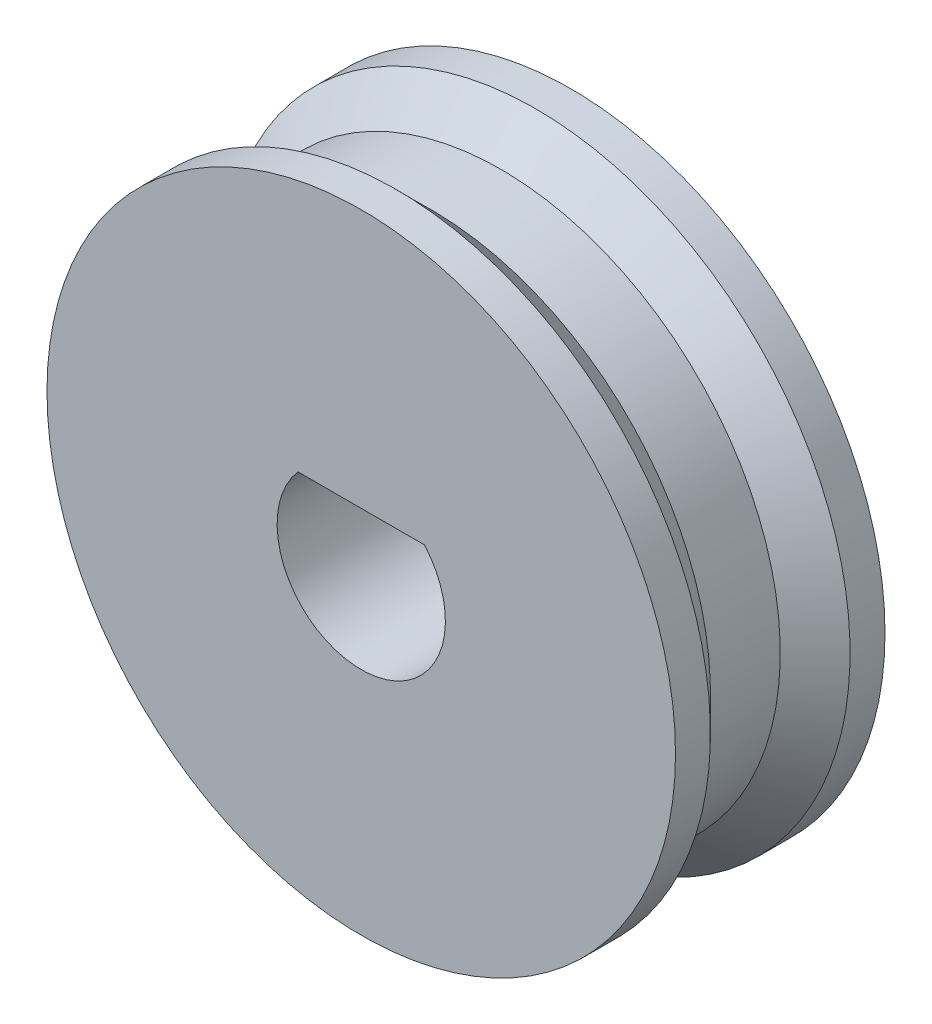
ISO-10303-21;
HEADER;
FILE_DESCRIPTION(('STEP AP214'),'2;1');
FILE_NAME('part.step','',(''),(''),'','','');
FILE_SCHEMA(('AUTOMOTIVE_DESIGN { 1 0 10303 214 1 1 1 1 }'));
ENDSEC;
DATA;
#1=APPLICATION_CONTEXT('core data for automotive mechanical design processes');
#2=APPLICATION_PROTOCOL_DEFINITION('international standard','automotive_design',2000,#1);
#3=PRODUCT_CONTEXT('',#1,'mechanical');
#4=PRODUCT('Part','Part','',(#3));
#5=PRODUCT_RELATED_PRODUCT_CATEGORY('part','',(#4));
#6=PRODUCT_DEFINITION_FORMATION('','',#4);
#7=PRODUCT_DEFINITION_CONTEXT('part definition',#1,'design');
#8=PRODUCT_DEFINITION('design','',#6,#7);
#9=PRODUCT_DEFINITION_SHAPE('','',#8);
#10=(LENGTH_UNIT() NAMED_UNIT(*) SI_UNIT(.MILLI.,.METRE.));
#11=(NAMED_UNIT(*) PLANE_ANGLE_UNIT() SI_UNIT($,.RADIAN.));
#12=(NAMED_UNIT(*) SI_UNIT($,.STERADIAN.) SOLID_ANGLE_UNIT());
#13=UNCERTAINTY_MEASURE_WITH_UNIT(LENGTH_MEASURE(1.E-05),#10,'distance_accuracy_value','');
#14=(GEOMETRIC_REPRESENTATION_CONTEXT(3) GLOBAL_UNCERTAINTY_ASSIGNED_CONTEXT((#13)) GLOBAL_UNIT_ASSIGNED_CONTEXT((#10,
#11,#12)) REPRESENTATION_CONTEXT('',''));
#15=CARTESIAN_POINT('',(0.,0.,0.));
#16=DIRECTION('',(0.,0.,1.));
#17=DIRECTION('',(1.,0.,0.));
#18=AXIS2_PLACEMENT_3D('',#15,#16,#17);
#19=CARTESIAN_POINT('',(0.,0.,3.));
#20=DIRECTION('',(0.,0.,-1.));
#21=DIRECTION('',(-1.,0.,0.));
#22=AXIS2_PLACEMENT_3D('',#19,#20,#21);
#23=CYLINDRICAL_SURFACE('',#22,4.5);
#24=CARTESIAN_POINT('',(0.,0.,2.5));
#25=DIRECTION('',(0.,0.,-1.));
#26=DIRECTION('',(-1.,0.,0.));
#27=AXIS2_PLACEMENT_3D('',#24,#25,#26);
#28=CIRCLE('',#27,4.5);
#29=CARTESIAN_POINT('',(-4.5,0.,2.5));
#30=VERTEX_POINT('',#29);
#31=EDGE_CURVE('E79',#30,#30,#28,.T.);
#32=ORIENTED_EDGE('',*,*,#31,.F.);
#33=EDGE_LOOP('',(#32));
#34=FACE_BOUND('',#33,.T.);
#35=CARTESIAN_POINT('',(0.,0.,3.));
#36=DIRECTION('',(0.,0.,1.));
#37=DIRECTION('',(1.,0.,0.));
#38=AXIS2_PLACEMENT_3D('',#35,#36,#37);
#39=CIRCLE('',#38,4.5);
#40=CARTESIAN_POINT('',(4.5,0.,3.));
#41=VERTEX_POINT('',#40);
#42=EDGE_CURVE('E11',#41,#41,#39,.T.);
#43=ORIENTED_EDGE('',*,*,#42,.F.);
#44=EDGE_LOOP('',(#43));
#45=FACE_BOUND('',#44,.T.);
#46=ADVANCED_FACE('F39',(#34,#45),#23,.T.);
#47=CARTESIAN_POINT('',(0.,0.,3.));
#48=DIRECTION('',(0.,0.,1.));
#49=DIRECTION('',(1.,0.,0.));
#50=AXIS2_PLACEMENT_3D('',#47,#48,#49);
#51=PLANE('',#50);
#52=CARTESIAN_POINT('',(0.,0.,3.));
#53=DIRECTION('',(0.,0.,1.));
#54=DIRECTION('',(1.,0.,0.));
#55=AXIS2_PLACEMENT_3D('',#52,#53,#54);
#56=CIRCLE('',#55,1.205);
#57=CARTESIAN_POINT('',(-0.905538513813742,0.795,3.));
#58=VERTEX_POINT('',#57);
#59=CARTESIAN_POINT('',(0.905538513813742,0.795,3.));
#60=VERTEX_POINT('',#59);
#61=EDGE_CURVE('E86',#58,#60,#56,.T.);
#62=ORIENTED_EDGE('',*,*,#61,.F.);
#63=DIRECTION('',(-1.,0.,0.));
#64=VECTOR('',#63,1.);
#65=CARTESIAN_POINT('',(0.,0.795,3.));
#66=LINE('',#65,#64);
#67=EDGE_CURVE('E73',#60,#58,#66,.T.);
#68=ORIENTED_EDGE('',*,*,#67,.F.);
#69=EDGE_LOOP('',(#62,#68));
#70=FACE_BOUND('',#69,.T.);
#71=ORIENTED_EDGE('',*,*,#42,.T.);
#72=EDGE_LOOP('',(#71));
#73=FACE_BOUND('',#72,.T.);
#74=ADVANCED_FACE('F123',(#70,#73),#51,.T.);
#75=CARTESIAN_POINT('',(0.,0.,2.5));
#76=DIRECTION('',(0.,0.,1.));
#77=DIRECTION('',(1.,0.,0.));
#78=AXIS2_PLACEMENT_3D('',#75,#76,#77);
#79=CONICAL_SURFACE('',#78,4.5,0.78539816339745);
#80=CARTESIAN_POINT('',(0.,0.,2.));
#81=DIRECTION('',(0.,0.,-1.));
#82=DIRECTION('',(-1.,0.,0.));
#83=AXIS2_PLACEMENT_3D('',#80,#81,#82);
#84=CIRCLE('',#83,4.);
#85=CARTESIAN_POINT('',(-4.,0.,2.));
#86=VERTEX_POINT('',#85);
#87=EDGE_CURVE('E102',#86,#86,#84,.T.);
#88=ORIENTED_EDGE('',*,*,#87,.F.);
#89=EDGE_LOOP('',(#88));
#90=FACE_BOUND('',#89,.T.);
#91=ORIENTED_EDGE('',*,*,#31,.T.);
#92=EDGE_LOOP('',(#91));
#93=FACE_BOUND('',#92,.T.);
#94=ADVANCED_FACE('F128',(#90,#93),#79,.T.);
#95=CARTESIAN_POINT('',(0.,0.,0.));
#96=DIRECTION('',(0.,0.,-1.));
#97=DIRECTION('',(-1.,0.,0.));
#98=AXIS2_PLACEMENT_3D('',#95,#96,#97);
#99=CYLINDRICAL_SURFACE('',#98,4.);
#100=CARTESIAN_POINT('',(0.,0.,1.));
#101=DIRECTION('',(0.,0.,-1.));
#102=DIRECTION('',(-1.,0.,0.));
#103=AXIS2_PLACEMENT_3D('',#100,#101,#102);
#104=CIRCLE('',#103,4.);
#105=CARTESIAN_POINT('',(-4.,0.,1.));
#106=VERTEX_POINT('',#105);
#107=EDGE_CURVE('E98',#106,#106,#104,.T.);
#108=ORIENTED_EDGE('',*,*,#107,.F.);
#109=EDGE_LOOP('',(#108));
#110=FACE_BOUND('',#109,.T.);
#111=ORIENTED_EDGE('',*,*,#87,.T.);
#112=EDGE_LOOP('',(#111));
#113=FACE_BOUND('',#112,.T.);
#114=ADVANCED_FACE('F118',(#110,#113),#99,.T.);
#115=CARTESIAN_POINT('',(0.,0.,1.));
#116=DIRECTION('',(0.,0.,-1.));
#117=DIRECTION('',(-1.,0.,0.));
#118=AXIS2_PLACEMENT_3D('',#115,#116,#117);
#119=CONICAL_SURFACE('',#118,4.,0.78539816339745);
#120=CARTESIAN_POINT('',(0.,0.,0.5));
#121=DIRECTION('',(0.,0.,-1.));
#122=DIRECTION('',(-1.,0.,0.));
#123=AXIS2_PLACEMENT_3D('',#120,#121,#122);
#124=CIRCLE('',#123,4.5);
#125=CARTESIAN_POINT('',(-4.5,0.,0.5));
#126=VERTEX_POINT('',#125);
#127=EDGE_CURVE('E94',#126,#126,#124,.T.);
#128=ORIENTED_EDGE('',*,*,#127,.F.);
#129=EDGE_LOOP('',(#128));
#130=FACE_BOUND('',#129,.T.);
#131=ORIENTED_EDGE('',*,*,#107,.T.);
#132=EDGE_LOOP('',(#131));
#133=FACE_BOUND('',#132,.T.);
#134=ADVANCED_FACE('F112',(#130,#133),#119,.T.);
#135=CARTESIAN_POINT('',(0.,0.,0.));
#136=DIRECTION('',(0.,0.,1.));
#137=DIRECTION('',(1.,0.,0.));
#138=AXIS2_PLACEMENT_3D('',#135,#136,#137);
#139=PLANE('',#138);
#140=DIRECTION('',(-1.,0.,0.));
#141=VECTOR('',#140,1.);
#142=CARTESIAN_POINT('',(0.,0.795,0.));
#143=LINE('',#142,#141);
#144=CARTESIAN_POINT('',(0.905538513813742,0.795,0.));
#145=VERTEX_POINT('',#144);
#146=CARTESIAN_POINT('',(-0.905538513813742,0.795,0.));
#147=VERTEX_POINT('',#146);
#148=EDGE_CURVE('E62',#145,#147,#143,.T.);
#149=ORIENTED_EDGE('',*,*,#148,.T.);
#150=CARTESIAN_POINT('',(0.,0.,0.));
#151=DIRECTION('',(0.,0.,1.));
#152=DIRECTION('',(1.,0.,0.));
#153=AXIS2_PLACEMENT_3D('',#150,#151,#152);
#154=CIRCLE('',#153,1.205);
#155=EDGE_CURVE('E68',#147,#145,#154,.T.);
#156=ORIENTED_EDGE('',*,*,#155,.T.);
#157=EDGE_LOOP('',(#149,#156));
#158=FACE_BOUND('',#157,.T.);
#159=CARTESIAN_POINT('',(0.,0.,0.));
#160=DIRECTION('',(0.,0.,1.));
#161=DIRECTION('',(1.,0.,0.));
#162=AXIS2_PLACEMENT_3D('',#159,#160,#161);
#163=CIRCLE('',#162,4.5);
#164=CARTESIAN_POINT('',(4.5,0.,0.));
#165=VERTEX_POINT('',#164);
#166=EDGE_CURVE('E43',#165,#165,#163,.T.);
#167=ORIENTED_EDGE('',*,*,#166,.F.);
#168=EDGE_LOOP('',(#167));
#169=FACE_BOUND('',#168,.T.);
#170=ADVANCED_FACE('F81',(#158,#169),#139,.F.);
#171=ORIENTED_EDGE('',*,*,#127,.T.);
#172=EDGE_LOOP('',(#171));
#173=FACE_BOUND('',#172,.T.);
#174=ORIENTED_EDGE('',*,*,#166,.T.);
#175=EDGE_LOOP('',(#174));
#176=FACE_BOUND('',#175,.T.);
#177=ADVANCED_FACE('F41',(#173,#176),#23,.T.);
#178=CARTESIAN_POINT('',(0.,0.795,3.));
#179=DIRECTION('',(0.,-1.,0.));
#180=DIRECTION('',(0.,0.,-1.));
#181=AXIS2_PLACEMENT_3D('',#178,#179,#180);
#182=PLANE('',#181);
#183=ORIENTED_EDGE('',*,*,#148,.F.);
#184=DIRECTION('',(0.,0.,-1.));
#185=VECTOR('',#184,1.);
#186=CARTESIAN_POINT('',(0.905538513813742,0.795,3.));
#187=LINE('',#186,#185);
#188=EDGE_CURVE('E70',#60,#145,#187,.T.);
#189=ORIENTED_EDGE('',*,*,#188,.F.);
#190=ORIENTED_EDGE('',*,*,#67,.T.);
#191=DIRECTION('',(0.,0.,-1.));
#192=VECTOR('',#191,1.);
#193=CARTESIAN_POINT('',(-0.905538513813742,0.795,3.));
#194=LINE('',#193,#192);
#195=EDGE_CURVE('E55',#58,#147,#194,.T.);
#196=ORIENTED_EDGE('',*,*,#195,.T.);
#197=EDGE_LOOP('',(#183,#189,#190,#196));
#198=FACE_BOUND('',#197,.T.);
#199=ADVANCED_FACE('F75',(#198),#182,.T.);
#200=CARTESIAN_POINT('',(0.,0.,3.));
#201=DIRECTION('',(0.,0.,-1.));
#202=DIRECTION('',(-1.,0.,0.));
#203=AXIS2_PLACEMENT_3D('',#200,#201,#202);
#204=CYLINDRICAL_SURFACE('',#203,1.205);
#205=ORIENTED_EDGE('',*,*,#155,.F.);
#206=ORIENTED_EDGE('',*,*,#195,.F.);
#207=ORIENTED_EDGE('',*,*,#61,.T.);
#208=ORIENTED_EDGE('',*,*,#188,.T.);
#209=EDGE_LOOP('',(#205,#206,#207,#208));
#210=FACE_BOUND('',#209,.T.);
#211=ADVANCED_FACE('F69',(#210),#204,.F.);
#212=CLOSED_SHELL('',(#46,#74,#94,#114,#134,#170,#177,#199,#211));
#213=MANIFOLD_SOLID_BREP('B2',#212);
#214=ADVANCED_BREP_SHAPE_REPRESENTATION('',(#18,#213),#14);
#215=SHAPE_DEFINITION_REPRESENTATION(#9,#214);
ENDSEC;
END-ISO-10303-21;
